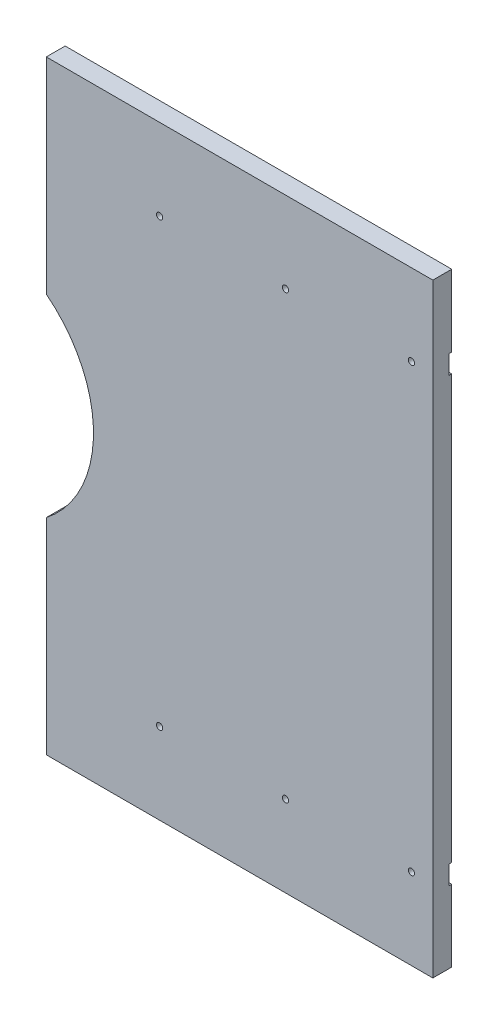
ISO-10303-21;
HEADER;
FILE_DESCRIPTION(('STEP AP214'),'2;1');
FILE_NAME('part.step','',(''),(''),'','','');
FILE_SCHEMA(('AUTOMOTIVE_DESIGN { 1 0 10303 214 1 1 1 1 }'));
ENDSEC;
DATA;
#1=APPLICATION_CONTEXT('core data for automotive mechanical design processes');
#2=APPLICATION_PROTOCOL_DEFINITION('international standard','automotive_design',2000,#1);
#3=PRODUCT_CONTEXT('',#1,'mechanical');
#4=PRODUCT('Part','Part','',(#3));
#5=PRODUCT_RELATED_PRODUCT_CATEGORY('part','',(#4));
#6=PRODUCT_DEFINITION_FORMATION('','',#4);
#7=PRODUCT_DEFINITION_CONTEXT('part definition',#1,'design');
#8=PRODUCT_DEFINITION('design','',#6,#7);
#9=PRODUCT_DEFINITION_SHAPE('','',#8);
#10=(LENGTH_UNIT() NAMED_UNIT(*) SI_UNIT(.MILLI.,.METRE.));
#11=(NAMED_UNIT(*) PLANE_ANGLE_UNIT() SI_UNIT($,.RADIAN.));
#12=(NAMED_UNIT(*) SI_UNIT($,.STERADIAN.) SOLID_ANGLE_UNIT());
#13=UNCERTAINTY_MEASURE_WITH_UNIT(LENGTH_MEASURE(1.E-05),#10,'distance_accuracy_value','');
#14=(GEOMETRIC_REPRESENTATION_CONTEXT(3) GLOBAL_UNCERTAINTY_ASSIGNED_CONTEXT((#13)) GLOBAL_UNIT_ASSIGNED_CONTEXT((#10,
#11,#12)) REPRESENTATION_CONTEXT('',''));
#15=CARTESIAN_POINT('',(0.,0.,0.));
#16=DIRECTION('',(0.,0.,1.));
#17=DIRECTION('',(1.,0.,0.));
#18=AXIS2_PLACEMENT_3D('',#15,#16,#17);
#19=CARTESIAN_POINT('',(-153.5,240.,15.));
#20=DIRECTION('',(1.,0.,0.));
#21=DIRECTION('',(0.,1.,0.));
#22=AXIS2_PLACEMENT_3D('',#19,#20,#21);
#23=PLANE('',#22);
#24=DIRECTION('',(0.,-1.,0.));
#25=VECTOR('',#24,1.);
#26=CARTESIAN_POINT('',(-153.5,240.,15.));
#27=LINE('',#26,#25);
#28=CARTESIAN_POINT('',(-153.5,-76.8521307446969,15.));
#29=VERTEX_POINT('',#28);
#30=CARTESIAN_POINT('',(-153.5,-240.,15.));
#31=VERTEX_POINT('',#30);
#32=EDGE_CURVE('E159',#29,#31,#27,.T.);
#33=ORIENTED_EDGE('',*,*,#32,.F.);
#34=DIRECTION('',(0.,0.,-1.));
#35=VECTOR('',#34,1.);
#36=CARTESIAN_POINT('',(-153.5,-76.8521307446969,15.));
#37=LINE('',#36,#35);
#38=CARTESIAN_POINT('',(-153.5,-76.8521307446969,0.));
#39=VERTEX_POINT('',#38);
#40=EDGE_CURVE('E139',#29,#39,#37,.T.);
#41=ORIENTED_EDGE('',*,*,#40,.T.);
#42=DIRECTION('',(0.,-1.,0.));
#43=VECTOR('',#42,1.);
#44=CARTESIAN_POINT('',(-153.5,240.,0.));
#45=LINE('',#44,#43);
#46=CARTESIAN_POINT('',(-153.5,-168.,0.));
#47=VERTEX_POINT('',#46);
#48=EDGE_CURVE('E59',#39,#47,#45,.T.);
#49=ORIENTED_EDGE('',*,*,#48,.T.);
#50=DIRECTION('',(0.,0.,-1.));
#51=VECTOR('',#50,1.);
#52=CARTESIAN_POINT('',(-153.5,-168.,2.));
#53=LINE('',#52,#51);
#54=CARTESIAN_POINT('',(-153.5,-168.,2.));
#55=VERTEX_POINT('',#54);
#56=EDGE_CURVE('E219',#55,#47,#53,.T.);
#57=ORIENTED_EDGE('',*,*,#56,.F.);
#58=DIRECTION('',(0.,1.,0.));
#59=VECTOR('',#58,1.);
#60=CARTESIAN_POINT('',(-153.5,-183.,2.));
#61=LINE('',#60,#59);
#62=CARTESIAN_POINT('',(-153.5,-183.,2.));
#63=VERTEX_POINT('',#62);
#64=EDGE_CURVE('E256',#63,#55,#61,.T.);
#65=ORIENTED_EDGE('',*,*,#64,.F.);
#66=DIRECTION('',(0.,0.,-1.));
#67=VECTOR('',#66,1.);
#68=CARTESIAN_POINT('',(-153.5,-183.,2.));
#69=LINE('',#68,#67);
#70=CARTESIAN_POINT('',(-153.5,-183.,0.));
#71=VERTEX_POINT('',#70);
#72=EDGE_CURVE('E221',#63,#71,#69,.T.);
#73=ORIENTED_EDGE('',*,*,#72,.T.);
#74=CARTESIAN_POINT('',(-153.5,-240.,0.));
#75=VERTEX_POINT('',#74);
#76=EDGE_CURVE('E201',#71,#75,#45,.T.);
#77=ORIENTED_EDGE('',*,*,#76,.T.);
#78=DIRECTION('',(0.,0.,-1.));
#79=VECTOR('',#78,1.);
#80=CARTESIAN_POINT('',(-153.5,-240.,15.));
#81=LINE('',#80,#79);
#82=EDGE_CURVE('E11',#31,#75,#81,.T.);
#83=ORIENTED_EDGE('',*,*,#82,.F.);
#84=EDGE_LOOP('',(#33,#41,#49,#57,#65,#73,#77,#83));
#85=FACE_BOUND('',#84,.T.);
#86=ADVANCED_FACE('F36',(#85),#23,.F.);
#87=CARTESIAN_POINT('',(0.,0.,0.));
#88=DIRECTION('',(0.,0.,-1.));
#89=DIRECTION('',(-1.,0.,0.));
#90=AXIS2_PLACEMENT_3D('',#87,#88,#89);
#91=PLANE('',#90);
#92=DIRECTION('',(-1.,0.,0.));
#93=VECTOR('',#92,1.);
#94=CARTESIAN_POINT('',(153.5,-183.,0.));
#95=LINE('',#94,#93);
#96=CARTESIAN_POINT('',(153.5,-183.,0.));
#97=VERTEX_POINT('',#96);
#98=EDGE_CURVE('E200',#97,#71,#95,.T.);
#99=ORIENTED_EDGE('',*,*,#98,.F.);
#100=DIRECTION('',(0.,1.,0.));
#101=VECTOR('',#100,1.);
#102=CARTESIAN_POINT('',(153.5,240.,0.));
#103=LINE('',#102,#101);
#104=CARTESIAN_POINT('',(153.5,-240.,0.));
#105=VERTEX_POINT('',#104);
#106=EDGE_CURVE('E177',#105,#97,#103,.T.);
#107=ORIENTED_EDGE('',*,*,#106,.F.);
#108=DIRECTION('',(1.,0.,0.));
#109=VECTOR('',#108,1.);
#110=CARTESIAN_POINT('',(153.5,-240.,0.));
#111=LINE('',#110,#109);
#112=EDGE_CURVE('E174',#75,#105,#111,.T.);
#113=ORIENTED_EDGE('',*,*,#112,.F.);
#114=ORIENTED_EDGE('',*,*,#76,.F.);
#115=EDGE_LOOP('',(#99,#107,#113,#114));
#116=FACE_BOUND('',#115,.T.);
#117=ADVANCED_FACE('F198',(#116),#91,.T.);
#118=DIRECTION('',(1.,0.,0.));
#119=VECTOR('',#118,1.);
#120=CARTESIAN_POINT('',(153.5,183.,0.));
#121=LINE('',#120,#119);
#122=CARTESIAN_POINT('',(-153.5,183.,0.));
#123=VERTEX_POINT('',#122);
#124=CARTESIAN_POINT('',(153.5,183.,0.));
#125=VERTEX_POINT('',#124);
#126=EDGE_CURVE('E227',#123,#125,#121,.T.);
#127=ORIENTED_EDGE('',*,*,#126,.F.);
#128=CARTESIAN_POINT('',(-153.5,240.,0.));
#129=VERTEX_POINT('',#128);
#130=EDGE_CURVE('E171',#129,#123,#45,.T.);
#131=ORIENTED_EDGE('',*,*,#130,.F.);
#132=DIRECTION('',(-1.,0.,0.));
#133=VECTOR('',#132,1.);
#134=CARTESIAN_POINT('',(153.5,240.,0.));
#135=LINE('',#134,#133);
#136=CARTESIAN_POINT('',(153.5,240.,0.));
#137=VERTEX_POINT('',#136);
#138=EDGE_CURVE('E163',#137,#129,#135,.T.);
#139=ORIENTED_EDGE('',*,*,#138,.F.);
#140=EDGE_CURVE('E176',#125,#137,#103,.T.);
#141=ORIENTED_EDGE('',*,*,#140,.F.);
#142=EDGE_LOOP('',(#127,#131,#139,#141));
#143=FACE_BOUND('',#142,.T.);
#144=ADVANCED_FACE('F283',(#143),#91,.T.);
#145=CARTESIAN_POINT('',(-153.5,168.,0.));
#146=VERTEX_POINT('',#145);
#147=CARTESIAN_POINT('',(-153.5,76.8521307446969,0.));
#148=VERTEX_POINT('',#147);
#149=EDGE_CURVE('E152',#146,#148,#45,.T.);
#150=ORIENTED_EDGE('',*,*,#149,.T.);
#151=DIRECTION('',(0.,0.,-1.));
#152=VECTOR('',#151,1.);
#153=CARTESIAN_POINT('',(-153.5,76.8521307446969,15.));
#154=LINE('',#153,#152);
#155=CARTESIAN_POINT('',(-153.5,76.8521307446969,15.));
#156=VERTEX_POINT('',#155);
#157=EDGE_CURVE('E51',#156,#148,#154,.T.);
#158=ORIENTED_EDGE('',*,*,#157,.F.);
#159=CARTESIAN_POINT('',(-153.5,240.,15.));
#160=VERTEX_POINT('',#159);
#161=EDGE_CURVE('E149',#160,#156,#27,.T.);
#162=ORIENTED_EDGE('',*,*,#161,.F.);
#163=DIRECTION('',(0.,0.,-1.));
#164=VECTOR('',#163,1.);
#165=CARTESIAN_POINT('',(-153.5,240.,15.));
#166=LINE('',#165,#164);
#167=EDGE_CURVE('E170',#160,#129,#166,.T.);
#168=ORIENTED_EDGE('',*,*,#167,.T.);
#169=ORIENTED_EDGE('',*,*,#130,.T.);
#170=DIRECTION('',(0.,0.,-1.));
#171=VECTOR('',#170,1.);
#172=CARTESIAN_POINT('',(-153.5,183.,2.));
#173=LINE('',#172,#171);
#174=CARTESIAN_POINT('',(-153.5,183.,2.));
#175=VERTEX_POINT('',#174);
#176=EDGE_CURVE('E240',#175,#123,#173,.T.);
#177=ORIENTED_EDGE('',*,*,#176,.F.);
#178=DIRECTION('',(0.,1.,0.));
#179=VECTOR('',#178,1.);
#180=CARTESIAN_POINT('',(-153.5,183.,2.));
#181=LINE('',#180,#179);
#182=CARTESIAN_POINT('',(-153.5,168.,2.));
#183=VERTEX_POINT('',#182);
#184=EDGE_CURVE('E230',#183,#175,#181,.T.);
#185=ORIENTED_EDGE('',*,*,#184,.F.);
#186=DIRECTION('',(0.,0.,-1.));
#187=VECTOR('',#186,1.);
#188=CARTESIAN_POINT('',(-153.5,168.,2.));
#189=LINE('',#188,#187);
#190=EDGE_CURVE('E241',#183,#146,#189,.T.);
#191=ORIENTED_EDGE('',*,*,#190,.T.);
#192=EDGE_LOOP('',(#150,#158,#162,#168,#169,#177,#185,#191));
#193=FACE_BOUND('',#192,.T.);
#194=ADVANCED_FACE('F38',(#193),#23,.F.);
#195=CARTESIAN_POINT('',(153.5,-240.,15.));
#196=DIRECTION('',(0.,1.,0.));
#197=DIRECTION('',(-1.,0.,0.));
#198=AXIS2_PLACEMENT_3D('',#195,#196,#197);
#199=PLANE('',#198);
#200=ORIENTED_EDGE('',*,*,#112,.T.);
#201=DIRECTION('',(0.,0.,-1.));
#202=VECTOR('',#201,1.);
#203=CARTESIAN_POINT('',(153.5,-240.,15.));
#204=LINE('',#203,#202);
#205=CARTESIAN_POINT('',(153.5,-240.,15.));
#206=VERTEX_POINT('',#205);
#207=EDGE_CURVE('E44',#206,#105,#204,.T.);
#208=ORIENTED_EDGE('',*,*,#207,.F.);
#209=DIRECTION('',(1.,0.,0.));
#210=VECTOR('',#209,1.);
#211=CARTESIAN_POINT('',(153.5,-240.,15.));
#212=LINE('',#211,#210);
#213=EDGE_CURVE('E158',#31,#206,#212,.T.);
#214=ORIENTED_EDGE('',*,*,#213,.F.);
#215=ORIENTED_EDGE('',*,*,#82,.T.);
#216=EDGE_LOOP('',(#200,#208,#214,#215));
#217=FACE_BOUND('',#216,.T.);
#218=ADVANCED_FACE('F286',(#217),#199,.F.);
#219=CARTESIAN_POINT('',(153.5,240.,15.));
#220=DIRECTION('',(-1.,0.,0.));
#221=DIRECTION('',(0.,-1.,0.));
#222=AXIS2_PLACEMENT_3D('',#219,#220,#221);
#223=PLANE('',#222);
#224=ORIENTED_EDGE('',*,*,#106,.T.);
#225=DIRECTION('',(0.,0.,-1.));
#226=VECTOR('',#225,1.);
#227=CARTESIAN_POINT('',(153.5,-183.,2.));
#228=LINE('',#227,#226);
#229=CARTESIAN_POINT('',(153.5,-183.,2.));
#230=VERTEX_POINT('',#229);
#231=EDGE_CURVE('E213',#230,#97,#228,.T.);
#232=ORIENTED_EDGE('',*,*,#231,.F.);
#233=DIRECTION('',(0.,-1.,0.));
#234=VECTOR('',#233,1.);
#235=CARTESIAN_POINT('',(153.5,-183.,2.));
#236=LINE('',#235,#234);
#237=CARTESIAN_POINT('',(153.5,-168.,2.));
#238=VERTEX_POINT('',#237);
#239=EDGE_CURVE('E210',#238,#230,#236,.T.);
#240=ORIENTED_EDGE('',*,*,#239,.F.);
#241=DIRECTION('',(0.,0.,-1.));
#242=VECTOR('',#241,1.);
#243=CARTESIAN_POINT('',(153.5,-168.,2.));
#244=LINE('',#243,#242);
#245=CARTESIAN_POINT('',(153.5,-168.,0.));
#246=VERTEX_POINT('',#245);
#247=EDGE_CURVE('E216',#238,#246,#244,.T.);
#248=ORIENTED_EDGE('',*,*,#247,.T.);
#249=CARTESIAN_POINT('',(153.5,168.,0.));
#250=VERTEX_POINT('',#249);
#251=EDGE_CURVE('E180',#246,#250,#103,.T.);
#252=ORIENTED_EDGE('',*,*,#251,.T.);
#253=DIRECTION('',(0.,0.,-1.));
#254=VECTOR('',#253,1.);
#255=CARTESIAN_POINT('',(153.5,168.,2.));
#256=LINE('',#255,#254);
#257=CARTESIAN_POINT('',(153.5,168.,2.));
#258=VERTEX_POINT('',#257);
#259=EDGE_CURVE('E165',#258,#250,#256,.T.);
#260=ORIENTED_EDGE('',*,*,#259,.F.);
#261=DIRECTION('',(0.,-1.,0.));
#262=VECTOR('',#261,1.);
#263=CARTESIAN_POINT('',(153.5,183.,2.));
#264=LINE('',#263,#262);
#265=CARTESIAN_POINT('',(153.5,183.,2.));
#266=VERTEX_POINT('',#265);
#267=EDGE_CURVE('E223',#266,#258,#264,.T.);
#268=ORIENTED_EDGE('',*,*,#267,.F.);
#269=DIRECTION('',(0.,0.,-1.));
#270=VECTOR('',#269,1.);
#271=CARTESIAN_POINT('',(153.5,183.,2.));
#272=LINE('',#271,#270);
#273=EDGE_CURVE('E237',#266,#125,#272,.T.);
#274=ORIENTED_EDGE('',*,*,#273,.T.);
#275=ORIENTED_EDGE('',*,*,#140,.T.);
#276=DIRECTION('',(0.,0.,-1.));
#277=VECTOR('',#276,1.);
#278=CARTESIAN_POINT('',(153.5,240.,15.));
#279=LINE('',#278,#277);
#280=CARTESIAN_POINT('',(153.5,240.,15.));
#281=VERTEX_POINT('',#280);
#282=EDGE_CURVE('E183',#281,#137,#279,.T.);
#283=ORIENTED_EDGE('',*,*,#282,.F.);
#284=DIRECTION('',(0.,1.,0.));
#285=VECTOR('',#284,1.);
#286=CARTESIAN_POINT('',(153.5,240.,15.));
#287=LINE('',#286,#285);
#288=EDGE_CURVE('E161',#206,#281,#287,.T.);
#289=ORIENTED_EDGE('',*,*,#288,.F.);
#290=ORIENTED_EDGE('',*,*,#207,.T.);
#291=EDGE_LOOP('',(#224,#232,#240,#248,#252,#260,#268,#274,#275,#283,#289,#290));
#292=FACE_BOUND('',#291,.T.);
#293=ADVANCED_FACE('F190',(#292),#223,.F.);
#294=CARTESIAN_POINT('',(153.5,240.,15.));
#295=DIRECTION('',(0.,-1.,0.));
#296=DIRECTION('',(1.,0.,0.));
#297=AXIS2_PLACEMENT_3D('',#294,#295,#296);
#298=PLANE('',#297);
#299=ORIENTED_EDGE('',*,*,#138,.T.);
#300=ORIENTED_EDGE('',*,*,#167,.F.);
#301=DIRECTION('',(-1.,0.,0.));
#302=VECTOR('',#301,1.);
#303=CARTESIAN_POINT('',(153.5,240.,15.));
#304=LINE('',#303,#302);
#305=EDGE_CURVE('E156',#281,#160,#304,.T.);
#306=ORIENTED_EDGE('',*,*,#305,.F.);
#307=ORIENTED_EDGE('',*,*,#282,.T.);
#308=EDGE_LOOP('',(#299,#300,#306,#307));
#309=FACE_BOUND('',#308,.T.);
#310=ADVANCED_FACE('F305',(#309),#298,.F.);
#311=CARTESIAN_POINT('',(0.,0.,15.));
#312=DIRECTION('',(0.,0.,-1.));
#313=DIRECTION('',(-1.,0.,0.));
#314=AXIS2_PLACEMENT_3D('',#311,#312,#313);
#315=PLANE('',#314);
#316=CARTESIAN_POINT('',(-63.5,-175.5,15.));
#317=DIRECTION('',(0.,0.,-1.));
#318=DIRECTION('',(-1.,0.,0.));
#319=AXIS2_PLACEMENT_3D('',#316,#317,#318);
#320=CIRCLE('',#319,2.49999999999999);
#321=CARTESIAN_POINT('',(-66.,-175.5,15.));
#322=VERTEX_POINT('',#321);
#323=EDGE_CURVE('E364',#322,#322,#320,.T.);
#324=ORIENTED_EDGE('',*,*,#323,.T.);
#325=EDGE_LOOP('',(#324));
#326=FACE_BOUND('',#325,.T.);
#327=CARTESIAN_POINT('',(36.5,-175.500000000001,15.));
#328=DIRECTION('',(0.,0.,-1.));
#329=DIRECTION('',(-1.,0.,0.));
#330=AXIS2_PLACEMENT_3D('',#327,#328,#329);
#331=CIRCLE('',#330,2.49999999999999);
#332=CARTESIAN_POINT('',(34.,-175.500000000001,15.));
#333=VERTEX_POINT('',#332);
#334=EDGE_CURVE('E358',#333,#333,#331,.T.);
#335=ORIENTED_EDGE('',*,*,#334,.T.);
#336=EDGE_LOOP('',(#335));
#337=FACE_BOUND('',#336,.T.);
#338=CARTESIAN_POINT('',(136.5,-175.500000000002,15.));
#339=DIRECTION('',(0.,0.,-1.));
#340=DIRECTION('',(-1.,0.,0.));
#341=AXIS2_PLACEMENT_3D('',#338,#339,#340);
#342=CIRCLE('',#341,2.49999999999997);
#343=CARTESIAN_POINT('',(134.,-175.500000000002,15.));
#344=VERTEX_POINT('',#343);
#345=EDGE_CURVE('E352',#344,#344,#342,.T.);
#346=ORIENTED_EDGE('',*,*,#345,.T.);
#347=EDGE_LOOP('',(#346));
#348=FACE_BOUND('',#347,.T.);
#349=CARTESIAN_POINT('',(136.5,175.500000000002,15.));
#350=DIRECTION('',(0.,0.,-1.));
#351=DIRECTION('',(-1.,0.,0.));
#352=AXIS2_PLACEMENT_3D('',#349,#350,#351);
#353=CIRCLE('',#352,2.49999999999997);
#354=CARTESIAN_POINT('',(134.,175.500000000002,15.));
#355=VERTEX_POINT('',#354);
#356=EDGE_CURVE('E348',#355,#355,#353,.T.);
#357=ORIENTED_EDGE('',*,*,#356,.T.);
#358=EDGE_LOOP('',(#357));
#359=FACE_BOUND('',#358,.T.);
#360=CARTESIAN_POINT('',(36.5,175.500000000001,15.));
#361=DIRECTION('',(0.,0.,-1.));
#362=DIRECTION('',(-1.,0.,0.));
#363=AXIS2_PLACEMENT_3D('',#360,#361,#362);
#364=CIRCLE('',#363,2.49999999999999);
#365=CARTESIAN_POINT('',(34.,175.500000000001,15.));
#366=VERTEX_POINT('',#365);
#367=EDGE_CURVE('E339',#366,#366,#364,.T.);
#368=ORIENTED_EDGE('',*,*,#367,.T.);
#369=EDGE_LOOP('',(#368));
#370=FACE_BOUND('',#369,.T.);
#371=CARTESIAN_POINT('',(-63.5,175.5,15.));
#372=DIRECTION('',(0.,0.,-1.));
#373=DIRECTION('',(-1.,0.,0.));
#374=AXIS2_PLACEMENT_3D('',#371,#372,#373);
#375=CIRCLE('',#374,2.49999999999999);
#376=CARTESIAN_POINT('',(-66.,175.5,15.));
#377=VERTEX_POINT('',#376);
#378=EDGE_CURVE('E338',#377,#377,#375,.T.);
#379=ORIENTED_EDGE('',*,*,#378,.T.);
#380=EDGE_LOOP('',(#379));
#381=FACE_BOUND('',#380,.T.);
#382=ORIENTED_EDGE('',*,*,#161,.T.);
#383=CARTESIAN_POINT('',(-213.5,0.,15.));
#384=DIRECTION('',(0.,0.,-1.));
#385=DIRECTION('',(-1.,0.,0.));
#386=AXIS2_PLACEMENT_3D('',#383,#384,#385);
#387=CIRCLE('',#386,97.4999999999999);
#388=EDGE_CURVE('E137',#156,#29,#387,.T.);
#389=ORIENTED_EDGE('',*,*,#388,.T.);
#390=ORIENTED_EDGE('',*,*,#32,.T.);
#391=ORIENTED_EDGE('',*,*,#213,.T.);
#392=ORIENTED_EDGE('',*,*,#288,.T.);
#393=ORIENTED_EDGE('',*,*,#305,.T.);
#394=EDGE_LOOP('',(#382,#389,#390,#391,#392,#393));
#395=FACE_BOUND('',#394,.T.);
#396=ADVANCED_FACE('F154',(#326,#337,#348,#359,#370,#381,#395),#315,.F.);
#397=CARTESIAN_POINT('',(-213.5,0.,0.));
#398=DIRECTION('',(0.,0.,-1.));
#399=DIRECTION('',(-1.,0.,0.));
#400=AXIS2_PLACEMENT_3D('',#397,#398,#399);
#401=CIRCLE('',#400,97.4999999999999);
#402=EDGE_CURVE('E143',#148,#39,#401,.T.);
#403=ORIENTED_EDGE('',*,*,#402,.F.);
#404=ORIENTED_EDGE('',*,*,#149,.F.);
#405=DIRECTION('',(-1.,0.,0.));
#406=VECTOR('',#405,1.);
#407=CARTESIAN_POINT('',(153.5,168.,0.));
#408=LINE('',#407,#406);
#409=EDGE_CURVE('E215',#250,#146,#408,.T.);
#410=ORIENTED_EDGE('',*,*,#409,.F.);
#411=ORIENTED_EDGE('',*,*,#251,.F.);
#412=DIRECTION('',(1.,0.,0.));
#413=VECTOR('',#412,1.);
#414=CARTESIAN_POINT('',(153.5,-168.,0.));
#415=LINE('',#414,#413);
#416=EDGE_CURVE('E204',#47,#246,#415,.T.);
#417=ORIENTED_EDGE('',*,*,#416,.F.);
#418=ORIENTED_EDGE('',*,*,#48,.F.);
#419=EDGE_LOOP('',(#403,#404,#410,#411,#417,#418));
#420=FACE_BOUND('',#419,.T.);
#421=ADVANCED_FACE('F251',(#420),#91,.T.);
#422=CARTESIAN_POINT('',(153.5,183.,2.));
#423=DIRECTION('',(0.,1.,0.));
#424=DIRECTION('',(-1.,0.,0.));
#425=AXIS2_PLACEMENT_3D('',#422,#423,#424);
#426=PLANE('',#425);
#427=ORIENTED_EDGE('',*,*,#126,.T.);
#428=ORIENTED_EDGE('',*,*,#273,.F.);
#429=DIRECTION('',(1.,0.,0.));
#430=VECTOR('',#429,1.);
#431=CARTESIAN_POINT('',(153.5,183.,2.));
#432=LINE('',#431,#430);
#433=EDGE_CURVE('E232',#175,#266,#432,.T.);
#434=ORIENTED_EDGE('',*,*,#433,.F.);
#435=ORIENTED_EDGE('',*,*,#176,.T.);
#436=EDGE_LOOP('',(#427,#428,#434,#435));
#437=FACE_BOUND('',#436,.T.);
#438=ADVANCED_FACE('F298',(#437),#426,.F.);
#439=CARTESIAN_POINT('',(153.5,168.,2.));
#440=DIRECTION('',(0.,-1.,0.));
#441=DIRECTION('',(0.,0.,-1.));
#442=AXIS2_PLACEMENT_3D('',#439,#440,#441);
#443=PLANE('',#442);
#444=ORIENTED_EDGE('',*,*,#409,.T.);
#445=ORIENTED_EDGE('',*,*,#190,.F.);
#446=DIRECTION('',(-1.,0.,0.));
#447=VECTOR('',#446,1.);
#448=CARTESIAN_POINT('',(153.5,168.,2.));
#449=LINE('',#448,#447);
#450=EDGE_CURVE('E226',#258,#183,#449,.T.);
#451=ORIENTED_EDGE('',*,*,#450,.F.);
#452=ORIENTED_EDGE('',*,*,#259,.T.);
#453=EDGE_LOOP('',(#444,#445,#451,#452));
#454=FACE_BOUND('',#453,.T.);
#455=ADVANCED_FACE('F247',(#454),#443,.F.);
#456=CARTESIAN_POINT('',(0.,0.,2.));
#457=DIRECTION('',(0.,0.,-1.));
#458=DIRECTION('',(-1.,0.,0.));
#459=AXIS2_PLACEMENT_3D('',#456,#457,#458);
#460=PLANE('',#459);
#461=CARTESIAN_POINT('',(136.5,175.500000000002,2.));
#462=DIRECTION('',(0.,0.,-1.));
#463=DIRECTION('',(-1.,0.,0.));
#464=AXIS2_PLACEMENT_3D('',#461,#462,#463);
#465=CIRCLE('',#464,2.5);
#466=CARTESIAN_POINT('',(134.,175.500000000002,2.));
#467=VERTEX_POINT('',#466);
#468=EDGE_CURVE('E323',#467,#467,#465,.T.);
#469=ORIENTED_EDGE('',*,*,#468,.F.);
#470=EDGE_LOOP('',(#469));
#471=FACE_BOUND('',#470,.T.);
#472=CARTESIAN_POINT('',(36.5,175.500000000001,2.));
#473=DIRECTION('',(0.,0.,-1.));
#474=DIRECTION('',(-1.,0.,0.));
#475=AXIS2_PLACEMENT_3D('',#472,#473,#474);
#476=CIRCLE('',#475,2.49999999999999);
#477=CARTESIAN_POINT('',(34.,175.500000000001,2.));
#478=VERTEX_POINT('',#477);
#479=EDGE_CURVE('E327',#478,#478,#476,.T.);
#480=ORIENTED_EDGE('',*,*,#479,.F.);
#481=EDGE_LOOP('',(#480));
#482=FACE_BOUND('',#481,.T.);
#483=CARTESIAN_POINT('',(-63.5,175.5,2.));
#484=DIRECTION('',(0.,0.,-1.));
#485=DIRECTION('',(-1.,0.,0.));
#486=AXIS2_PLACEMENT_3D('',#483,#484,#485);
#487=CIRCLE('',#486,2.49999999999999);
#488=CARTESIAN_POINT('',(-66.,175.5,2.));
#489=VERTEX_POINT('',#488);
#490=EDGE_CURVE('E331',#489,#489,#487,.T.);
#491=ORIENTED_EDGE('',*,*,#490,.F.);
#492=EDGE_LOOP('',(#491));
#493=FACE_BOUND('',#492,.T.);
#494=ORIENTED_EDGE('',*,*,#267,.T.);
#495=ORIENTED_EDGE('',*,*,#450,.T.);
#496=ORIENTED_EDGE('',*,*,#184,.T.);
#497=ORIENTED_EDGE('',*,*,#433,.T.);
#498=EDGE_LOOP('',(#494,#495,#496,#497));
#499=FACE_BOUND('',#498,.T.);
#500=ADVANCED_FACE('F277',(#471,#482,#493,#499),#460,.T.);
#501=CARTESIAN_POINT('',(153.5,-183.,2.));
#502=DIRECTION('',(0.,-1.,0.));
#503=DIRECTION('',(1.,0.,0.));
#504=AXIS2_PLACEMENT_3D('',#501,#502,#503);
#505=PLANE('',#504);
#506=ORIENTED_EDGE('',*,*,#98,.T.);
#507=ORIENTED_EDGE('',*,*,#72,.F.);
#508=DIRECTION('',(-1.,0.,0.));
#509=VECTOR('',#508,1.);
#510=CARTESIAN_POINT('',(153.5,-183.,2.));
#511=LINE('',#510,#509);
#512=EDGE_CURVE('E206',#230,#63,#511,.T.);
#513=ORIENTED_EDGE('',*,*,#512,.F.);
#514=ORIENTED_EDGE('',*,*,#231,.T.);
#515=EDGE_LOOP('',(#506,#507,#513,#514));
#516=FACE_BOUND('',#515,.T.);
#517=ADVANCED_FACE('F258',(#516),#505,.F.);
#518=CARTESIAN_POINT('',(153.5,-168.,2.));
#519=DIRECTION('',(0.,1.,0.));
#520=DIRECTION('',(0.,0.,1.));
#521=AXIS2_PLACEMENT_3D('',#518,#519,#520);
#522=PLANE('',#521);
#523=ORIENTED_EDGE('',*,*,#416,.T.);
#524=ORIENTED_EDGE('',*,*,#247,.F.);
#525=DIRECTION('',(1.,0.,0.));
#526=VECTOR('',#525,1.);
#527=CARTESIAN_POINT('',(153.5,-168.,2.));
#528=LINE('',#527,#526);
#529=EDGE_CURVE('E265',#55,#238,#528,.T.);
#530=ORIENTED_EDGE('',*,*,#529,.F.);
#531=ORIENTED_EDGE('',*,*,#56,.T.);
#532=EDGE_LOOP('',(#523,#524,#530,#531));
#533=FACE_BOUND('',#532,.T.);
#534=ADVANCED_FACE('F268',(#533),#522,.F.);
#535=CARTESIAN_POINT('',(0.,0.,2.));
#536=DIRECTION('',(0.,0.,-1.));
#537=DIRECTION('',(-1.,0.,0.));
#538=AXIS2_PLACEMENT_3D('',#535,#536,#537);
#539=PLANE('',#538);
#540=CARTESIAN_POINT('',(-63.5,-175.5,2.));
#541=DIRECTION('',(0.,0.,-1.));
#542=DIRECTION('',(-1.,0.,0.));
#543=AXIS2_PLACEMENT_3D('',#540,#541,#542);
#544=CIRCLE('',#543,2.49999999999999);
#545=CARTESIAN_POINT('',(-66.,-175.5,2.));
#546=VERTEX_POINT('',#545);
#547=EDGE_CURVE('E366',#546,#546,#544,.T.);
#548=ORIENTED_EDGE('',*,*,#547,.F.);
#549=EDGE_LOOP('',(#548));
#550=FACE_BOUND('',#549,.T.);
#551=CARTESIAN_POINT('',(36.5,-175.500000000001,2.));
#552=DIRECTION('',(0.,0.,-1.));
#553=DIRECTION('',(-1.,0.,0.));
#554=AXIS2_PLACEMENT_3D('',#551,#552,#553);
#555=CIRCLE('',#554,2.49999999999999);
#556=CARTESIAN_POINT('',(34.,-175.500000000001,2.));
#557=VERTEX_POINT('',#556);
#558=EDGE_CURVE('E361',#557,#557,#555,.T.);
#559=ORIENTED_EDGE('',*,*,#558,.F.);
#560=EDGE_LOOP('',(#559));
#561=FACE_BOUND('',#560,.T.);
#562=CARTESIAN_POINT('',(136.5,-175.500000000002,2.));
#563=DIRECTION('',(0.,0.,-1.));
#564=DIRECTION('',(-1.,0.,0.));
#565=AXIS2_PLACEMENT_3D('',#562,#563,#564);
#566=CIRCLE('',#565,2.5);
#567=CARTESIAN_POINT('',(134.,-175.500000000002,2.));
#568=VERTEX_POINT('',#567);
#569=EDGE_CURVE('E355',#568,#568,#566,.T.);
#570=ORIENTED_EDGE('',*,*,#569,.F.);
#571=EDGE_LOOP('',(#570));
#572=FACE_BOUND('',#571,.T.);
#573=ORIENTED_EDGE('',*,*,#512,.T.);
#574=ORIENTED_EDGE('',*,*,#64,.T.);
#575=ORIENTED_EDGE('',*,*,#529,.T.);
#576=ORIENTED_EDGE('',*,*,#239,.T.);
#577=EDGE_LOOP('',(#573,#574,#575,#576));
#578=FACE_BOUND('',#577,.T.);
#579=ADVANCED_FACE('F261',(#550,#561,#572,#578),#539,.T.);
#580=CARTESIAN_POINT('',(-213.5,0.,15.));
#581=DIRECTION('',(0.,0.,-1.));
#582=DIRECTION('',(-1.,0.,0.));
#583=AXIS2_PLACEMENT_3D('',#580,#581,#582);
#584=CYLINDRICAL_SURFACE('',#583,97.4999999999999);
#585=ORIENTED_EDGE('',*,*,#402,.T.);
#586=ORIENTED_EDGE('',*,*,#40,.F.);
#587=ORIENTED_EDGE('',*,*,#388,.F.);
#588=ORIENTED_EDGE('',*,*,#157,.T.);
#589=EDGE_LOOP('',(#585,#586,#587,#588));
#590=FACE_BOUND('',#589,.T.);
#591=ADVANCED_FACE('F138',(#590),#584,.F.);
#592=CARTESIAN_POINT('',(-63.5,175.5,2.));
#593=DIRECTION('',(0.,0.,-1.));
#594=DIRECTION('',(-1.,0.,0.));
#595=AXIS2_PLACEMENT_3D('',#592,#593,#594);
#596=CYLINDRICAL_SURFACE('',#595,2.49999999999999);
#597=ORIENTED_EDGE('',*,*,#378,.F.);
#598=EDGE_LOOP('',(#597));
#599=FACE_BOUND('',#598,.T.);
#600=ORIENTED_EDGE('',*,*,#490,.T.);
#601=EDGE_LOOP('',(#600));
#602=FACE_BOUND('',#601,.T.);
#603=ADVANCED_FACE('F396',(#599,#602),#596,.F.);
#604=CARTESIAN_POINT('',(36.5,175.500000000001,2.));
#605=DIRECTION('',(0.,0.,-1.));
#606=DIRECTION('',(-1.,0.,0.));
#607=AXIS2_PLACEMENT_3D('',#604,#605,#606);
#608=CYLINDRICAL_SURFACE('',#607,2.49999999999999);
#609=ORIENTED_EDGE('',*,*,#367,.F.);
#610=EDGE_LOOP('',(#609));
#611=FACE_BOUND('',#610,.T.);
#612=ORIENTED_EDGE('',*,*,#479,.T.);
#613=EDGE_LOOP('',(#612));
#614=FACE_BOUND('',#613,.T.);
#615=ADVANCED_FACE('F388',(#611,#614),#608,.F.);
#616=CARTESIAN_POINT('',(136.5,175.500000000002,2.));
#617=DIRECTION('',(0.,0.,-1.));
#618=DIRECTION('',(-1.,0.,0.));
#619=AXIS2_PLACEMENT_3D('',#616,#617,#618);
#620=CYLINDRICAL_SURFACE('',#619,2.49999999999999);
#621=ORIENTED_EDGE('',*,*,#356,.F.);
#622=EDGE_LOOP('',(#621));
#623=FACE_BOUND('',#622,.T.);
#624=ORIENTED_EDGE('',*,*,#468,.T.);
#625=EDGE_LOOP('',(#624));
#626=FACE_BOUND('',#625,.T.);
#627=ADVANCED_FACE('F379',(#623,#626),#620,.F.);
#628=CARTESIAN_POINT('',(136.5,-175.500000000002,2.));
#629=DIRECTION('',(0.,0.,-1.));
#630=DIRECTION('',(-1.,0.,0.));
#631=AXIS2_PLACEMENT_3D('',#628,#629,#630);
#632=CYLINDRICAL_SURFACE('',#631,2.49999999999999);
#633=ORIENTED_EDGE('',*,*,#345,.F.);
#634=EDGE_LOOP('',(#633));
#635=FACE_BOUND('',#634,.T.);
#636=ORIENTED_EDGE('',*,*,#569,.T.);
#637=EDGE_LOOP('',(#636));
#638=FACE_BOUND('',#637,.T.);
#639=ADVANCED_FACE('F376',(#635,#638),#632,.F.);
#640=CARTESIAN_POINT('',(36.5,-175.500000000001,2.));
#641=DIRECTION('',(0.,0.,-1.));
#642=DIRECTION('',(-1.,0.,0.));
#643=AXIS2_PLACEMENT_3D('',#640,#641,#642);
#644=CYLINDRICAL_SURFACE('',#643,2.49999999999999);
#645=ORIENTED_EDGE('',*,*,#334,.F.);
#646=EDGE_LOOP('',(#645));
#647=FACE_BOUND('',#646,.T.);
#648=ORIENTED_EDGE('',*,*,#558,.T.);
#649=EDGE_LOOP('',(#648));
#650=FACE_BOUND('',#649,.T.);
#651=ADVANCED_FACE('F378',(#647,#650),#644,.F.);
#652=CARTESIAN_POINT('',(-63.5,-175.5,2.));
#653=DIRECTION('',(0.,0.,-1.));
#654=DIRECTION('',(-1.,0.,0.));
#655=AXIS2_PLACEMENT_3D('',#652,#653,#654);
#656=CYLINDRICAL_SURFACE('',#655,2.49999999999999);
#657=ORIENTED_EDGE('',*,*,#323,.F.);
#658=EDGE_LOOP('',(#657));
#659=FACE_BOUND('',#658,.T.);
#660=ORIENTED_EDGE('',*,*,#547,.T.);
#661=EDGE_LOOP('',(#660));
#662=FACE_BOUND('',#661,.T.);
#663=ADVANCED_FACE('F370',(#659,#662),#656,.F.);
#664=CLOSED_SHELL('',(#86,#117,#144,#194,#218,#293,#310,#396,#421,#438,#455,#500,#517,#534,#579,
#591,#603,#615,#627,#639,#651,#663));
#665=MANIFOLD_SOLID_BREP('B2',#664);
#666=ADVANCED_BREP_SHAPE_REPRESENTATION('',(#18,#665),#14);
#667=SHAPE_DEFINITION_REPRESENTATION(#9,#666);
ENDSEC;
END-ISO-10303-21;
